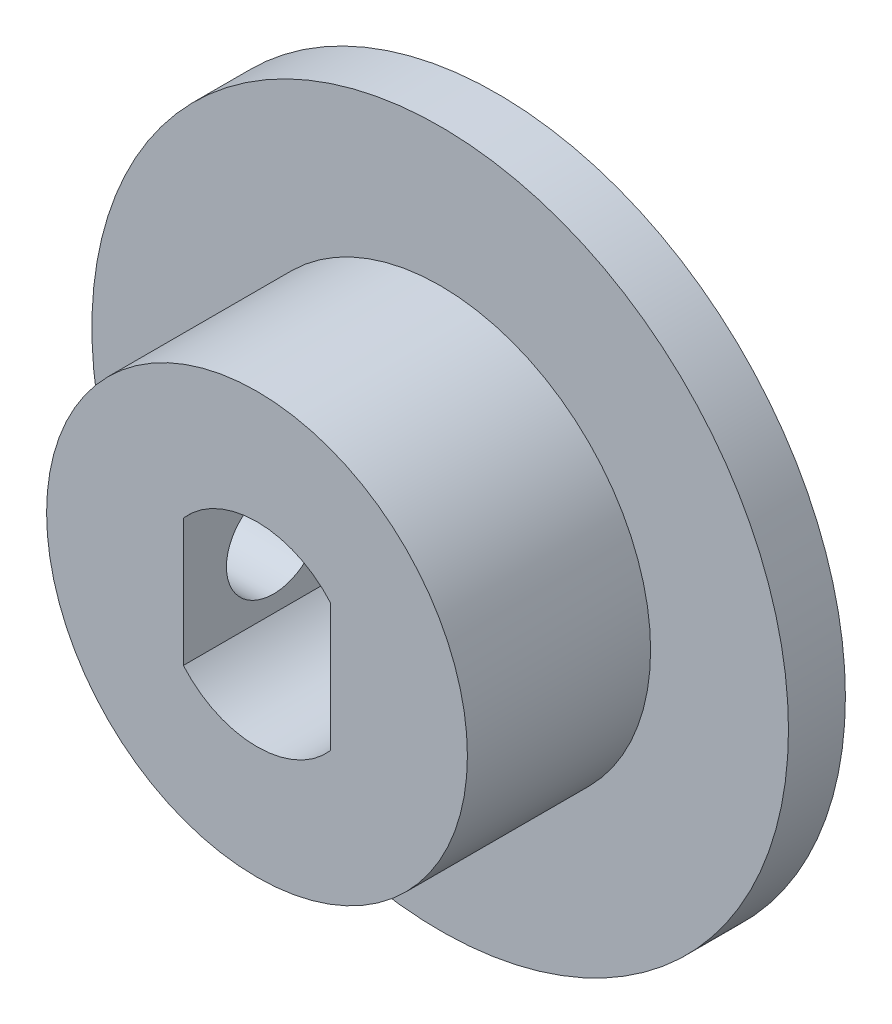
ISO-10303-21;
HEADER;
FILE_DESCRIPTION(('STEP AP214'),'2;1');
FILE_NAME('part.step','',(''),(''),'','','');
FILE_SCHEMA(('AUTOMOTIVE_DESIGN { 1 0 10303 214 1 1 1 1 }'));
ENDSEC;
DATA;
#1=APPLICATION_CONTEXT('core data for automotive mechanical design processes');
#2=APPLICATION_PROTOCOL_DEFINITION('international standard','automotive_design',2000,#1);
#3=PRODUCT_CONTEXT('',#1,'mechanical');
#4=PRODUCT('Part','Part','',(#3));
#5=PRODUCT_RELATED_PRODUCT_CATEGORY('part','',(#4));
#6=PRODUCT_DEFINITION_FORMATION('','',#4);
#7=PRODUCT_DEFINITION_CONTEXT('part definition',#1,'design');
#8=PRODUCT_DEFINITION('design','',#6,#7);
#9=PRODUCT_DEFINITION_SHAPE('','',#8);
#10=(LENGTH_UNIT() NAMED_UNIT(*) SI_UNIT(.MILLI.,.METRE.));
#11=(NAMED_UNIT(*) PLANE_ANGLE_UNIT() SI_UNIT($,.RADIAN.));
#12=(NAMED_UNIT(*) SI_UNIT($,.STERADIAN.) SOLID_ANGLE_UNIT());
#13=UNCERTAINTY_MEASURE_WITH_UNIT(LENGTH_MEASURE(1.E-05),#10,'distance_accuracy_value','');
#14=(GEOMETRIC_REPRESENTATION_CONTEXT(3) GLOBAL_UNCERTAINTY_ASSIGNED_CONTEXT((#13)) GLOBAL_UNIT_ASSIGNED_CONTEXT((#10,
#11,#12)) REPRESENTATION_CONTEXT('',''));
#15=CARTESIAN_POINT('',(0.,0.,0.));
#16=DIRECTION('',(0.,0.,1.));
#17=DIRECTION('',(1.,0.,0.));
#18=AXIS2_PLACEMENT_3D('',#15,#16,#17);
#19=CARTESIAN_POINT('',(0.,0.,2.921));
#20=DIRECTION('',(0.,0.,-1.));
#21=DIRECTION('',(-1.,0.,0.));
#22=AXIS2_PLACEMENT_3D('',#19,#20,#21);
#23=CYLINDRICAL_SURFACE('',#22,17.8689);
#24=CARTESIAN_POINT('',(0.,0.,2.921));
#25=DIRECTION('',(0.,0.,1.));
#26=DIRECTION('',(1.,0.,0.));
#27=AXIS2_PLACEMENT_3D('',#24,#25,#26);
#28=CIRCLE('',#27,17.8689);
#29=CARTESIAN_POINT('',(17.8689,0.,2.921));
#30=VERTEX_POINT('',#29);
#31=EDGE_CURVE('E11',#30,#30,#28,.T.);
#32=ORIENTED_EDGE('',*,*,#31,.F.);
#33=EDGE_LOOP('',(#32));
#34=FACE_BOUND('',#33,.T.);
#35=CARTESIAN_POINT('',(0.,0.,0.));
#36=DIRECTION('',(0.,0.,1.));
#37=DIRECTION('',(1.,0.,0.));
#38=AXIS2_PLACEMENT_3D('',#35,#36,#37);
#39=CIRCLE('',#38,17.8689);
#40=CARTESIAN_POINT('',(17.8689,0.,0.));
#41=VERTEX_POINT('',#40);
#42=EDGE_CURVE('E40',#41,#41,#39,.T.);
#43=ORIENTED_EDGE('',*,*,#42,.T.);
#44=EDGE_LOOP('',(#43));
#45=FACE_BOUND('',#44,.T.);
#46=ADVANCED_FACE('F32',(#34,#45),#23,.T.);
#47=CARTESIAN_POINT('',(0.,0.,2.921));
#48=DIRECTION('',(0.,0.,1.));
#49=DIRECTION('',(1.,0.,0.));
#50=AXIS2_PLACEMENT_3D('',#47,#48,#49);
#51=PLANE('',#50);
#52=CARTESIAN_POINT('',(0.,0.,2.921));
#53=DIRECTION('',(0.,0.,1.));
#54=DIRECTION('',(1.,0.,0.));
#55=AXIS2_PLACEMENT_3D('',#52,#53,#54);
#56=CIRCLE('',#55,10.795);
#57=CARTESIAN_POINT('',(10.795,0.,2.921));
#58=VERTEX_POINT('',#57);
#59=EDGE_CURVE('E113',#58,#58,#56,.T.);
#60=ORIENTED_EDGE('',*,*,#59,.F.);
#61=EDGE_LOOP('',(#60));
#62=FACE_BOUND('',#61,.T.);
#63=ORIENTED_EDGE('',*,*,#31,.T.);
#64=EDGE_LOOP('',(#63));
#65=FACE_BOUND('',#64,.T.);
#66=ADVANCED_FACE('F126',(#62,#65),#51,.T.);
#67=CARTESIAN_POINT('',(0.,0.,0.));
#68=DIRECTION('',(0.,0.,1.));
#69=DIRECTION('',(1.,0.,0.));
#70=AXIS2_PLACEMENT_3D('',#67,#68,#69);
#71=PLANE('',#70);
#72=DIRECTION('',(0.,1.,0.));
#73=VECTOR('',#72,1.);
#74=CARTESIAN_POINT('',(3.77825,-3.27486288836647,0.));
#75=LINE('',#74,#73);
#76=CARTESIAN_POINT('',(3.77825,-3.27486288836647,0.));
#77=VERTEX_POINT('',#76);
#78=CARTESIAN_POINT('',(3.77825,3.27486288836647,0.));
#79=VERTEX_POINT('',#78);
#80=EDGE_CURVE('E82',#77,#79,#75,.T.);
#81=ORIENTED_EDGE('',*,*,#80,.T.);
#82=CARTESIAN_POINT('',(0.,0.,0.));
#83=DIRECTION('',(0.,0.,1.));
#84=DIRECTION('',(1.,0.,0.));
#85=AXIS2_PLACEMENT_3D('',#82,#83,#84);
#86=CIRCLE('',#85,4.99999);
#87=CARTESIAN_POINT('',(-3.77825,3.27486288836647,0.));
#88=VERTEX_POINT('',#87);
#89=EDGE_CURVE('E76',#79,#88,#86,.T.);
#90=ORIENTED_EDGE('',*,*,#89,.T.);
#91=DIRECTION('',(0.,-1.,0.));
#92=VECTOR('',#91,1.);
#93=CARTESIAN_POINT('',(-3.77825,-3.27486288836647,0.));
#94=LINE('',#93,#92);
#95=CARTESIAN_POINT('',(-3.77825,-3.27486288836647,0.));
#96=VERTEX_POINT('',#95);
#97=EDGE_CURVE('E85',#88,#96,#94,.T.);
#98=ORIENTED_EDGE('',*,*,#97,.T.);
#99=CARTESIAN_POINT('',(0.,0.,0.));
#100=DIRECTION('',(0.,0.,1.));
#101=DIRECTION('',(1.,0.,0.));
#102=AXIS2_PLACEMENT_3D('',#99,#100,#101);
#103=CIRCLE('',#102,4.99999);
#104=EDGE_CURVE('E48',#96,#77,#103,.T.);
#105=ORIENTED_EDGE('',*,*,#104,.T.);
#106=EDGE_LOOP('',(#81,#90,#98,#105));
#107=FACE_BOUND('',#106,.T.);
#108=ORIENTED_EDGE('',*,*,#42,.F.);
#109=EDGE_LOOP('',(#108));
#110=FACE_BOUND('',#109,.T.);
#111=ADVANCED_FACE('F89',(#107,#110),#71,.F.);
#112=CARTESIAN_POINT('',(0.,0.,12.319));
#113=DIRECTION('',(0.,0.,-1.));
#114=DIRECTION('',(-1.,0.,0.));
#115=AXIS2_PLACEMENT_3D('',#112,#113,#114);
#116=CYLINDRICAL_SURFACE('',#115,10.795);
#117=CARTESIAN_POINT('',(-10.795,0.,10.1092));
#118=CARTESIAN_POINT('',(-10.7949975459043,-0.133756889753461,10.1091955373465));
#119=CARTESIAN_POINT('',(-10.7924888094349,-0.267567071300817,10.0980408929788));
#120=CARTESIAN_POINT('',(-10.7827233811664,-0.531381602712345,10.0537663227238));
#121=CARTESIAN_POINT('',(-10.7754633989653,-0.661383249801345,10.0206311743602));
#122=CARTESIAN_POINT('',(-10.7570031836819,-0.913730355252272,9.93348924182708));
#123=CARTESIAN_POINT('',(-10.745807158631,-1.03608382640192,9.87950474168971));
#124=CARTESIAN_POINT('',(-10.7206808787914,-1.26999321898031,9.75226840308024));
#125=CARTESIAN_POINT('',(-10.7067506704218,-1.3815493236718,9.6790168917039));
#126=CARTESIAN_POINT('',(-10.6774197288994,-1.59256555403856,9.51403050450448));
#127=CARTESIAN_POINT('',(-10.6620000886539,-1.69181938163443,9.42203511477917));
#128=CARTESIAN_POINT('',(-10.6315602574297,-1.87362418103827,9.22273143925637));
#129=CARTESIAN_POINT('',(-10.6165401034541,-1.95617361022657,9.11542174077035));
#130=CARTESIAN_POINT('',(-10.5884128979533,-2.10314522517068,8.88699913022861));
#131=CARTESIAN_POINT('',(-10.5753300432369,-2.16734617143242,8.76574062199736));
#132=CARTESIAN_POINT('',(-10.552830781738,-2.27437873880571,8.51381486266605));
#133=CARTESIAN_POINT('',(-10.5434139156103,-2.31721303732886,8.38314879275794));
#134=CARTESIAN_POINT('',(-10.5295056794,-2.37961138800417,8.11835953275707));
#135=CARTESIAN_POINT('',(-10.5249369091999,-2.39954154822928,7.98432677062778));
#136=CARTESIAN_POINT('',(-10.5210098167014,-2.41670455068511,7.71474816462175));
#137=CARTESIAN_POINT('',(-10.5216508244316,-2.41394031138918,7.57920251753903));
#138=CARTESIAN_POINT('',(-10.5280008602357,-2.38608723504138,7.31317948211992));
#139=CARTESIAN_POINT('',(-10.5336129804822,-2.36142525474746,7.18265473583661));
#140=CARTESIAN_POINT('',(-10.5491195047637,-2.29115370624612,6.92764346941641));
#141=CARTESIAN_POINT('',(-10.5590141585906,-2.24554291612568,6.80315730196924));
#142=CARTESIAN_POINT('',(-10.5820654063078,-2.13428068425764,6.56256500778841));
#143=CARTESIAN_POINT('',(-10.5952483258518,-2.06846646309832,6.44653678602402));
#144=CARTESIAN_POINT('',(-10.6233747684481,-1.91877995329778,6.22701382196736));
#145=CARTESIAN_POINT('',(-10.638318541414,-1.83490509995481,6.123520863011));
#146=CARTESIAN_POINT('',(-10.668697582715,-1.64922569666579,5.92955024089265));
#147=CARTESIAN_POINT('',(-10.6841363233511,-1.54705855960272,5.83941985370049));
#148=CARTESIAN_POINT('',(-10.7134584245265,-1.32888285308091,5.67751411099257));
#149=CARTESIAN_POINT('',(-10.7273417544073,-1.21287401088407,5.60573911724059));
#150=CARTESIAN_POINT('',(-10.752037016001,-0.969873713599647,5.4824898299627));
#151=CARTESIAN_POINT('',(-10.7628418082517,-0.842857606178265,5.4310626196053));
#152=CARTESIAN_POINT('',(-10.7801097413397,-0.58169093341204,5.35037897021808));
#153=CARTESIAN_POINT('',(-10.7865735421965,-0.447541455998325,5.3211191606928));
#154=CARTESIAN_POINT('',(-10.7943367070128,-0.178893451256835,5.2861096553704));
#155=CARTESIAN_POINT('',(-10.7957402134781,-0.0444596410206983,5.27988579979561));
#156=CARTESIAN_POINT('',(-10.793517182386,0.223526934317258,5.28983746370105));
#157=CARTESIAN_POINT('',(-10.7898910019708,0.357079761298359,5.30601139278535));
#158=CARTESIAN_POINT('',(-10.7780819154398,0.617931098570812,5.35990660699643));
#159=CARTESIAN_POINT('',(-10.7699519378397,0.745283903096602,5.39737773835802));
#160=CARTESIAN_POINT('',(-10.7500458979826,0.991895751283473,5.49252486029297));
#161=CARTESIAN_POINT('',(-10.7382695157863,1.1111540836072,5.55020262387577));
#162=CARTESIAN_POINT('',(-10.7121209825485,1.34014164988844,5.68510355213685));
#163=CARTESIAN_POINT('',(-10.6977129893619,1.44970370605929,5.76260338886931));
#164=CARTESIAN_POINT('',(-10.6679699378668,1.65443757010278,5.93458579997467));
#165=CARTESIAN_POINT('',(-10.6526347536191,1.74960741692751,6.02907068485744));
#166=CARTESIAN_POINT('',(-10.6224037106437,1.92474176665859,6.23452113900239));
#167=CARTESIAN_POINT('',(-10.6075220493294,2.00437724260201,6.34576966829404));
#168=CARTESIAN_POINT('',(-10.5802200239029,2.1438375361131,6.58033956419242));
#169=CARTESIAN_POINT('',(-10.5677995518906,2.20366322223117,6.70366040118758));
#170=CARTESIAN_POINT('',(-10.546948049564,2.3013932272982,6.95820700765412));
#171=CARTESIAN_POINT('',(-10.5384943011335,2.33942266206845,7.08938278685249));
#172=CARTESIAN_POINT('',(-10.5264947133584,2.39284295622776,7.35647713465038));
#173=CARTESIAN_POINT('',(-10.5229480488605,2.40823762180616,7.49239490191649));
#174=CARTESIAN_POINT('',(-10.5212178207313,2.41578383670373,7.7617934019962));
#175=CARTESIAN_POINT('',(-10.5229137549812,2.40845761717485,7.89525899515163));
#176=CARTESIAN_POINT('',(-10.5312042242489,2.37194154697112,8.15900189012559));
#177=CARTESIAN_POINT('',(-10.5377986961463,2.34275197801783,8.28927923300418));
#178=CARTESIAN_POINT('',(-10.5550831970095,2.26359511973489,8.54251044255424));
#179=CARTESIAN_POINT('',(-10.5657576002099,2.21370704223073,8.66549020745582));
#180=CARTESIAN_POINT('',(-10.5900047021329,2.09463619180336,8.90141078790674));
#181=CARTESIAN_POINT('',(-10.603577718082,2.02545130676773,9.01435050274714));
#182=CARTESIAN_POINT('',(-10.6324502996176,1.86803248936309,9.22955219658834));
#183=CARTESIAN_POINT('',(-10.6477802277979,1.77942776999793,9.33153892477742));
#184=CARTESIAN_POINT('',(-10.6782388430681,1.58643179040931,9.5193673164439));
#185=CARTESIAN_POINT('',(-10.6933674826903,1.48203687590757,9.60520523230446));
#186=CARTESIAN_POINT('',(-10.7219646977844,1.25870199478846,9.75942712137953));
#187=CARTESIAN_POINT('',(-10.7354077297425,1.13958257377219,9.82755623567001));
#188=CARTESIAN_POINT('',(-10.758861167397,0.891305084261284,9.94271669101642));
#189=CARTESIAN_POINT('',(-10.7688743907615,0.762155363424102,9.98976535998952));
#190=CARTESIAN_POINT('',(-10.7825971176512,0.527437005309983,10.0532445316462));
#191=CARTESIAN_POINT('',(-10.7872189466138,0.423118352769588,10.0741870548417));
#192=CARTESIAN_POINT('',(-10.7934212896496,0.212544288330421,10.1021662274165));
#193=CARTESIAN_POINT('',(-10.7950019501298,0.106288969914642,10.1092035462162));
#194=CARTESIAN_POINT('',(-10.795,0.,10.1092));
#195=B_SPLINE_CURVE_WITH_KNOTS('',3,(#117,#118,#119,#120,#121,#122,#123,#124,#125,#126,#127,
#128,#129,#130,#131,#132,#133,#134,#135,#136,#137,#138,#139,#140,#141,#142,#143,#144,#145,#146,
#147,#148,#149,#150,#151,#152,#153,#154,#155,#156,#157,#158,#159,#160,#161,#162,#163,#164,#165,
#166,#167,#168,#169,#170,#171,#172,#173,#174,#175,#176,#177,#178,#179,#180,#181,#182,#183,#184,
#185,#186,#187,#188,#189,#190,#191,#192,#193,#194),.UNSPECIFIED.,.T.,.F.,(4,2,2,2,2,2,2,2,2,2,2,
2,2,2,2,2,2,2,2,2,2,2,2,2,2,2,2,2,2,2,2,2,2,2,2,2,2,2,4),(0.,0.40088154566901,0.802041009879735,
1.20277289145048,1.60349797024126,2.01022765181463,2.41699487698233,2.82847767161411,
3.23990889120446,3.64466793961253,4.04937493729396,4.44636198170392,4.84337218472099,
5.24366901091262,5.64402271882423,6.05343053443808,6.46284641838937,6.87320419439727,
7.28349956404711,7.68530112109593,8.08707414894844,8.48422275140857,8.88140620998139,
9.28446873756649,9.68758613609621,10.0984861347564,10.5093681153243,10.9178672818232,
11.3262977485683,11.7254107303546,12.1245185694343,12.5221129348499,12.9197508356412,
13.3257703645511,13.7318840015404,14.1435537873258,14.5548845610257,14.8734575934791,
15.1920152889031),.UNSPECIFIED.);
#196=CARTESIAN_POINT('',(-10.795,0.,10.1092));
#197=VERTEX_POINT('',#196);
#198=EDGE_CURVE('E98',#197,#197,#195,.T.);
#199=ORIENTED_EDGE('',*,*,#198,.T.);
#200=EDGE_LOOP('',(#199));
#201=FACE_BOUND('',#200,.T.);
#202=CARTESIAN_POINT('',(0.,0.,12.319));
#203=DIRECTION('',(0.,0.,1.));
#204=DIRECTION('',(1.,0.,0.));
#205=AXIS2_PLACEMENT_3D('',#202,#203,#204);
#206=CIRCLE('',#205,10.795);
#207=CARTESIAN_POINT('',(10.795,0.,12.319));
#208=VERTEX_POINT('',#207);
#209=EDGE_CURVE('E117',#208,#208,#206,.T.);
#210=ORIENTED_EDGE('',*,*,#209,.F.);
#211=EDGE_LOOP('',(#210));
#212=FACE_BOUND('',#211,.T.);
#213=ORIENTED_EDGE('',*,*,#59,.T.);
#214=EDGE_LOOP('',(#213));
#215=FACE_BOUND('',#214,.T.);
#216=ADVANCED_FACE('F125',(#201,#212,#215),#116,.T.);
#217=CARTESIAN_POINT('',(0.,0.,12.319));
#218=DIRECTION('',(0.,0.,1.));
#219=DIRECTION('',(1.,0.,0.));
#220=AXIS2_PLACEMENT_3D('',#217,#218,#219);
#221=PLANE('',#220);
#222=CARTESIAN_POINT('',(0.,0.,12.319));
#223=DIRECTION('',(0.,0.,1.));
#224=DIRECTION('',(1.,0.,0.));
#225=AXIS2_PLACEMENT_3D('',#222,#223,#224);
#226=CIRCLE('',#225,4.99999);
#227=CARTESIAN_POINT('',(3.77825,3.27486288836647,12.319));
#228=VERTEX_POINT('',#227);
#229=CARTESIAN_POINT('',(-3.77825,3.27486288836647,12.319));
#230=VERTEX_POINT('',#229);
#231=EDGE_CURVE('E56',#228,#230,#226,.T.);
#232=ORIENTED_EDGE('',*,*,#231,.F.);
#233=DIRECTION('',(0.,1.,0.));
#234=VECTOR('',#233,1.);
#235=CARTESIAN_POINT('',(3.77825,-3.27486288836647,12.319));
#236=LINE('',#235,#234);
#237=CARTESIAN_POINT('',(3.77825,-3.27486288836647,12.319));
#238=VERTEX_POINT('',#237);
#239=EDGE_CURVE('E92',#238,#228,#236,.T.);
#240=ORIENTED_EDGE('',*,*,#239,.F.);
#241=CARTESIAN_POINT('',(0.,0.,12.319));
#242=DIRECTION('',(0.,0.,1.));
#243=DIRECTION('',(1.,0.,0.));
#244=AXIS2_PLACEMENT_3D('',#241,#242,#243);
#245=CIRCLE('',#244,4.99999);
#246=CARTESIAN_POINT('',(-3.77825,-3.27486288836647,12.319));
#247=VERTEX_POINT('',#246);
#248=EDGE_CURVE('E95',#247,#238,#245,.T.);
#249=ORIENTED_EDGE('',*,*,#248,.F.);
#250=DIRECTION('',(0.,-1.,0.));
#251=VECTOR('',#250,1.);
#252=CARTESIAN_POINT('',(-3.77825,-3.27486288836647,12.319));
#253=LINE('',#252,#251);
#254=EDGE_CURVE('E107',#230,#247,#253,.T.);
#255=ORIENTED_EDGE('',*,*,#254,.F.);
#256=EDGE_LOOP('',(#232,#240,#249,#255));
#257=FACE_BOUND('',#256,.T.);
#258=ORIENTED_EDGE('',*,*,#209,.T.);
#259=EDGE_LOOP('',(#258));
#260=FACE_BOUND('',#259,.T.);
#261=ADVANCED_FACE('F131',(#257,#260),#221,.T.);
#262=CARTESIAN_POINT('',(0.,0.,0.));
#263=DIRECTION('',(0.,0.,1.));
#264=DIRECTION('',(1.,0.,0.));
#265=AXIS2_PLACEMENT_3D('',#262,#263,#264);
#266=CYLINDRICAL_SURFACE('',#265,4.99999);
#267=ORIENTED_EDGE('',*,*,#231,.T.);
#268=DIRECTION('',(0.,0.,1.));
#269=VECTOR('',#268,1.);
#270=CARTESIAN_POINT('',(-3.77825,3.27486288836647,0.));
#271=LINE('',#270,#269);
#272=EDGE_CURVE('E72',#88,#230,#271,.T.);
#273=ORIENTED_EDGE('',*,*,#272,.F.);
#274=ORIENTED_EDGE('',*,*,#89,.F.);
#275=DIRECTION('',(0.,0.,1.));
#276=VECTOR('',#275,1.);
#277=CARTESIAN_POINT('',(3.77825,3.27486288836647,0.));
#278=LINE('',#277,#276);
#279=EDGE_CURVE('E111',#79,#228,#278,.T.);
#280=ORIENTED_EDGE('',*,*,#279,.T.);
#281=EDGE_LOOP('',(#267,#273,#274,#280));
#282=FACE_BOUND('',#281,.T.);
#283=ADVANCED_FACE('F74',(#282),#266,.F.);
#284=CARTESIAN_POINT('',(3.77825,-3.27486288836647,0.));
#285=DIRECTION('',(1.,0.,0.));
#286=DIRECTION('',(0.,0.,-1.));
#287=AXIS2_PLACEMENT_3D('',#284,#285,#286);
#288=PLANE('',#287);
#289=ORIENTED_EDGE('',*,*,#239,.T.);
#290=ORIENTED_EDGE('',*,*,#279,.F.);
#291=ORIENTED_EDGE('',*,*,#80,.F.);
#292=DIRECTION('',(0.,0.,1.));
#293=VECTOR('',#292,1.);
#294=CARTESIAN_POINT('',(3.77825,-3.27486288836647,0.));
#295=LINE('',#294,#293);
#296=EDGE_CURVE('E114',#77,#238,#295,.T.);
#297=ORIENTED_EDGE('',*,*,#296,.T.);
#298=EDGE_LOOP('',(#289,#290,#291,#297));
#299=FACE_BOUND('',#298,.T.);
#300=ADVANCED_FACE('F168',(#299),#288,.F.);
#301=CARTESIAN_POINT('',(0.,0.,0.));
#302=DIRECTION('',(0.,0.,1.));
#303=DIRECTION('',(1.,0.,0.));
#304=AXIS2_PLACEMENT_3D('',#301,#302,#303);
#305=CYLINDRICAL_SURFACE('',#304,4.99999);
#306=ORIENTED_EDGE('',*,*,#248,.T.);
#307=ORIENTED_EDGE('',*,*,#296,.F.);
#308=ORIENTED_EDGE('',*,*,#104,.F.);
#309=DIRECTION('',(0.,0.,1.));
#310=VECTOR('',#309,1.);
#311=CARTESIAN_POINT('',(-3.77825,-3.27486288836647,0.));
#312=LINE('',#311,#310);
#313=EDGE_CURVE('E81',#96,#247,#312,.T.);
#314=ORIENTED_EDGE('',*,*,#313,.T.);
#315=EDGE_LOOP('',(#306,#307,#308,#314));
#316=FACE_BOUND('',#315,.T.);
#317=ADVANCED_FACE('F177',(#316),#305,.F.);
#318=CARTESIAN_POINT('',(-3.77825,-3.27486288836647,0.));
#319=DIRECTION('',(-1.,0.,0.));
#320=DIRECTION('',(0.,0.,1.));
#321=AXIS2_PLACEMENT_3D('',#318,#319,#320);
#322=PLANE('',#321);
#323=CARTESIAN_POINT('',(-3.77825,0.,7.6962));
#324=DIRECTION('',(-1.,0.,0.));
#325=DIRECTION('',(0.,0.,1.));
#326=AXIS2_PLACEMENT_3D('',#323,#324,#325);
#327=CIRCLE('',#326,2.413);
#328=CARTESIAN_POINT('',(-3.77825,0.,10.1092));
#329=VERTEX_POINT('',#328);
#330=EDGE_CURVE('E35',#329,#329,#327,.T.);
#331=ORIENTED_EDGE('',*,*,#330,.T.);
#332=EDGE_LOOP('',(#331));
#333=FACE_BOUND('',#332,.T.);
#334=ORIENTED_EDGE('',*,*,#254,.T.);
#335=ORIENTED_EDGE('',*,*,#313,.F.);
#336=ORIENTED_EDGE('',*,*,#97,.F.);
#337=ORIENTED_EDGE('',*,*,#272,.T.);
#338=EDGE_LOOP('',(#334,#335,#336,#337));
#339=FACE_BOUND('',#338,.T.);
#340=ADVANCED_FACE('F86',(#333,#339),#322,.F.);
#341=CARTESIAN_POINT('',(-16.002,0.,7.6962));
#342=DIRECTION('',(1.,0.,0.));
#343=DIRECTION('',(0.,0.,-1.));
#344=AXIS2_PLACEMENT_3D('',#341,#342,#343);
#345=CYLINDRICAL_SURFACE('',#344,2.413);
#346=ORIENTED_EDGE('',*,*,#330,.F.);
#347=EDGE_LOOP('',(#346));
#348=FACE_BOUND('',#347,.T.);
#349=ORIENTED_EDGE('',*,*,#198,.F.);
#350=EDGE_LOOP('',(#349));
#351=FACE_BOUND('',#350,.T.);
#352=ADVANCED_FACE('F200',(#348,#351),#345,.F.);
#353=CLOSED_SHELL('',(#46,#66,#111,#216,#261,#283,#300,#317,#340,#352));
#354=MANIFOLD_SOLID_BREP('B2',#353);
#355=ADVANCED_BREP_SHAPE_REPRESENTATION('',(#18,#354),#14);
#356=SHAPE_DEFINITION_REPRESENTATION(#9,#355);
ENDSEC;
END-ISO-10303-21;
